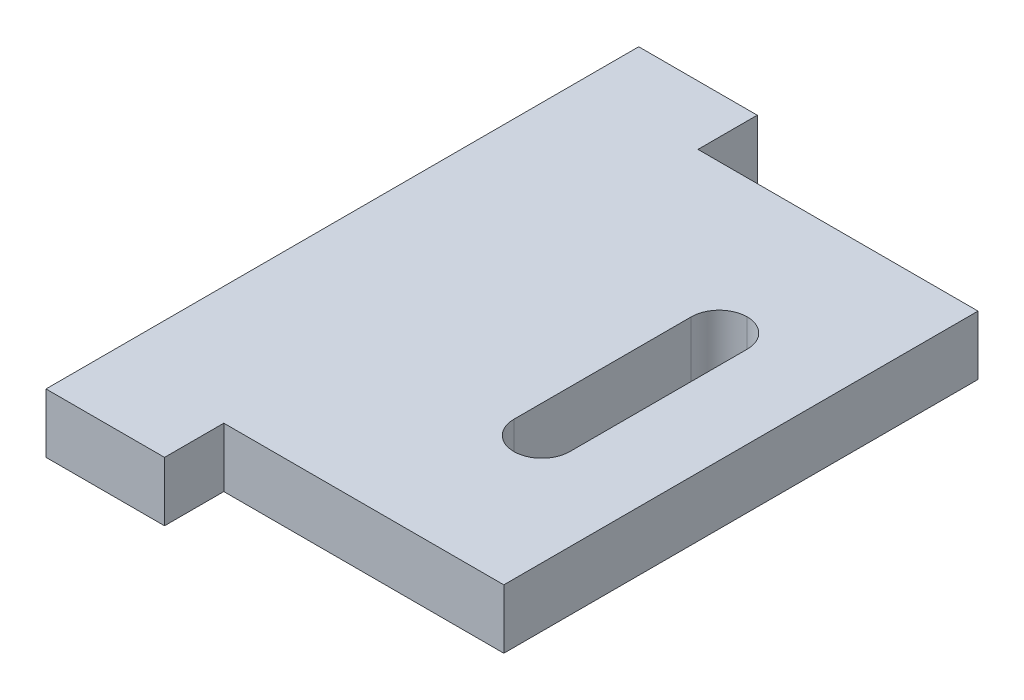
ISO-10303-21;
HEADER;
FILE_DESCRIPTION(('STEP AP214'),'2;1');
FILE_NAME('part.step','',(''),(''),'','','');
FILE_SCHEMA(('AUTOMOTIVE_DESIGN { 1 0 10303 214 1 1 1 1 }'));
ENDSEC;
DATA;
#1=APPLICATION_CONTEXT('core data for automotive mechanical design processes');
#2=APPLICATION_PROTOCOL_DEFINITION('international standard','automotive_design',2000,#1);
#3=PRODUCT_CONTEXT('',#1,'mechanical');
#4=PRODUCT('Part','Part','',(#3));
#5=PRODUCT_RELATED_PRODUCT_CATEGORY('part','',(#4));
#6=PRODUCT_DEFINITION_FORMATION('','',#4);
#7=PRODUCT_DEFINITION_CONTEXT('part definition',#1,'design');
#8=PRODUCT_DEFINITION('design','',#6,#7);
#9=PRODUCT_DEFINITION_SHAPE('','',#8);
#10=(LENGTH_UNIT() NAMED_UNIT(*) SI_UNIT(.MILLI.,.METRE.));
#11=(NAMED_UNIT(*) PLANE_ANGLE_UNIT() SI_UNIT($,.RADIAN.));
#12=(NAMED_UNIT(*) SI_UNIT($,.STERADIAN.) SOLID_ANGLE_UNIT());
#13=UNCERTAINTY_MEASURE_WITH_UNIT(LENGTH_MEASURE(1.E-05),#10,'distance_accuracy_value','');
#14=(GEOMETRIC_REPRESENTATION_CONTEXT(3) GLOBAL_UNCERTAINTY_ASSIGNED_CONTEXT((#13)) GLOBAL_UNIT_ASSIGNED_CONTEXT((#10,
#11,#12)) REPRESENTATION_CONTEXT('',''));
#15=CARTESIAN_POINT('',(0.,0.,0.));
#16=DIRECTION('',(0.,0.,1.));
#17=DIRECTION('',(1.,0.,0.));
#18=AXIS2_PLACEMENT_3D('',#15,#16,#17);
#19=CARTESIAN_POINT('',(-7.5,3.175,0.));
#20=DIRECTION('',(1.,0.,0.));
#21=DIRECTION('',(0.,0.,-1.));
#22=AXIS2_PLACEMENT_3D('',#19,#20,#21);
#23=PLANE('',#22);
#24=DIRECTION('',(0.,0.,1.));
#25=VECTOR('',#24,1.);
#26=CARTESIAN_POINT('',(-7.5,0.,0.));
#27=LINE('',#26,#25);
#28=CARTESIAN_POINT('',(-7.5,0.,-15.875));
#29=VERTEX_POINT('',#28);
#30=CARTESIAN_POINT('',(-7.5,0.,-12.7));
#31=VERTEX_POINT('',#30);
#32=EDGE_CURVE('E149',#29,#31,#27,.T.);
#33=ORIENTED_EDGE('',*,*,#32,.F.);
#34=DIRECTION('',(0.,-1.,0.));
#35=VECTOR('',#34,1.);
#36=CARTESIAN_POINT('',(-7.5,3.175,-15.875));
#37=LINE('',#36,#35);
#38=CARTESIAN_POINT('',(-7.5,3.175,-15.875));
#39=VERTEX_POINT('',#38);
#40=EDGE_CURVE('E145',#39,#29,#37,.T.);
#41=ORIENTED_EDGE('',*,*,#40,.F.);
#42=DIRECTION('',(0.,0.,1.));
#43=VECTOR('',#42,1.);
#44=CARTESIAN_POINT('',(-7.5,3.175,0.));
#45=LINE('',#44,#43);
#46=CARTESIAN_POINT('',(-7.5,3.175,-12.7));
#47=VERTEX_POINT('',#46);
#48=EDGE_CURVE('E148',#39,#47,#45,.T.);
#49=ORIENTED_EDGE('',*,*,#48,.T.);
#50=DIRECTION('',(0.,-1.,0.));
#51=VECTOR('',#50,1.);
#52=CARTESIAN_POINT('',(-7.5,3.175,-12.7));
#53=LINE('',#52,#51);
#54=EDGE_CURVE('E185',#47,#31,#53,.T.);
#55=ORIENTED_EDGE('',*,*,#54,.T.);
#56=EDGE_LOOP('',(#33,#41,#49,#55));
#57=FACE_BOUND('',#56,.T.);
#58=ADVANCED_FACE('F41',(#57),#23,.T.);
#59=CARTESIAN_POINT('',(0.,3.175,-15.875));
#60=DIRECTION('',(0.,0.,-1.));
#61=DIRECTION('',(-1.,0.,0.));
#62=AXIS2_PLACEMENT_3D('',#59,#60,#61);
#63=PLANE('',#62);
#64=DIRECTION('',(1.,0.,0.));
#65=VECTOR('',#64,1.);
#66=CARTESIAN_POINT('',(0.,0.,-15.875));
#67=LINE('',#66,#65);
#68=CARTESIAN_POINT('',(-13.85,0.,-15.875));
#69=VERTEX_POINT('',#68);
#70=EDGE_CURVE('E184',#69,#29,#67,.T.);
#71=ORIENTED_EDGE('',*,*,#70,.F.);
#72=DIRECTION('',(0.,-1.,0.));
#73=VECTOR('',#72,1.);
#74=CARTESIAN_POINT('',(-13.85,3.175,-15.875));
#75=LINE('',#74,#73);
#76=CARTESIAN_POINT('',(-13.85,3.175,-15.875));
#77=VERTEX_POINT('',#76);
#78=EDGE_CURVE('E154',#77,#69,#75,.T.);
#79=ORIENTED_EDGE('',*,*,#78,.F.);
#80=DIRECTION('',(1.,0.,0.));
#81=VECTOR('',#80,1.);
#82=CARTESIAN_POINT('',(0.,3.175,-15.875));
#83=LINE('',#82,#81);
#84=EDGE_CURVE('E159',#77,#39,#83,.T.);
#85=ORIENTED_EDGE('',*,*,#84,.T.);
#86=ORIENTED_EDGE('',*,*,#40,.T.);
#87=EDGE_LOOP('',(#71,#79,#85,#86));
#88=FACE_BOUND('',#87,.T.);
#89=ADVANCED_FACE('F170',(#88),#63,.T.);
#90=CARTESIAN_POINT('',(-13.85,3.175,0.));
#91=DIRECTION('',(1.,0.,0.));
#92=DIRECTION('',(0.,0.,-1.));
#93=AXIS2_PLACEMENT_3D('',#90,#91,#92);
#94=PLANE('',#93);
#95=DIRECTION('',(0.,0.,1.));
#96=VECTOR('',#95,1.);
#97=CARTESIAN_POINT('',(-13.85,0.,0.));
#98=LINE('',#97,#96);
#99=CARTESIAN_POINT('',(-13.85,0.,15.875));
#100=VERTEX_POINT('',#99);
#101=EDGE_CURVE('E187',#69,#100,#98,.T.);
#102=ORIENTED_EDGE('',*,*,#101,.T.);
#103=DIRECTION('',(0.,-1.,0.));
#104=VECTOR('',#103,1.);
#105=CARTESIAN_POINT('',(-13.85,3.175,15.875));
#106=LINE('',#105,#104);
#107=CARTESIAN_POINT('',(-13.85,3.175,15.875));
#108=VERTEX_POINT('',#107);
#109=EDGE_CURVE('E209',#108,#100,#106,.T.);
#110=ORIENTED_EDGE('',*,*,#109,.F.);
#111=DIRECTION('',(0.,0.,1.));
#112=VECTOR('',#111,1.);
#113=CARTESIAN_POINT('',(-13.85,3.175,0.));
#114=LINE('',#113,#112);
#115=EDGE_CURVE('E166',#77,#108,#114,.T.);
#116=ORIENTED_EDGE('',*,*,#115,.F.);
#117=ORIENTED_EDGE('',*,*,#78,.T.);
#118=EDGE_LOOP('',(#102,#110,#116,#117));
#119=FACE_BOUND('',#118,.T.);
#120=ADVANCED_FACE('F285',(#119),#94,.F.);
#121=CARTESIAN_POINT('',(0.,3.175,15.875));
#122=DIRECTION('',(0.,0.,-1.));
#123=DIRECTION('',(-1.,0.,0.));
#124=AXIS2_PLACEMENT_3D('',#121,#122,#123);
#125=PLANE('',#124);
#126=DIRECTION('',(1.,0.,0.));
#127=VECTOR('',#126,1.);
#128=CARTESIAN_POINT('',(0.,0.,15.875));
#129=LINE('',#128,#127);
#130=CARTESIAN_POINT('',(-7.5,0.,15.875));
#131=VERTEX_POINT('',#130);
#132=EDGE_CURVE('E186',#100,#131,#129,.T.);
#133=ORIENTED_EDGE('',*,*,#132,.T.);
#134=DIRECTION('',(0.,-1.,0.));
#135=VECTOR('',#134,1.);
#136=CARTESIAN_POINT('',(-7.5,3.175,15.875));
#137=LINE('',#136,#135);
#138=CARTESIAN_POINT('',(-7.5,3.175,15.875));
#139=VERTEX_POINT('',#138);
#140=EDGE_CURVE('E208',#139,#131,#137,.T.);
#141=ORIENTED_EDGE('',*,*,#140,.F.);
#142=DIRECTION('',(1.,0.,0.));
#143=VECTOR('',#142,1.);
#144=CARTESIAN_POINT('',(0.,3.175,15.875));
#145=LINE('',#144,#143);
#146=EDGE_CURVE('E173',#108,#139,#145,.T.);
#147=ORIENTED_EDGE('',*,*,#146,.F.);
#148=ORIENTED_EDGE('',*,*,#109,.T.);
#149=EDGE_LOOP('',(#133,#141,#147,#148));
#150=FACE_BOUND('',#149,.T.);
#151=ADVANCED_FACE('F289',(#150),#125,.F.);
#152=CARTESIAN_POINT('',(-7.5,0.,12.7));
#153=VERTEX_POINT('',#152);
#154=EDGE_CURVE('E188',#153,#131,#27,.T.);
#155=ORIENTED_EDGE('',*,*,#154,.F.);
#156=DIRECTION('',(0.,-1.,0.));
#157=VECTOR('',#156,1.);
#158=CARTESIAN_POINT('',(-7.5,3.175,12.7));
#159=LINE('',#158,#157);
#160=CARTESIAN_POINT('',(-7.5,3.175,12.7));
#161=VERTEX_POINT('',#160);
#162=EDGE_CURVE('E206',#161,#153,#159,.T.);
#163=ORIENTED_EDGE('',*,*,#162,.F.);
#164=EDGE_CURVE('E167',#161,#139,#45,.T.);
#165=ORIENTED_EDGE('',*,*,#164,.T.);
#166=ORIENTED_EDGE('',*,*,#140,.T.);
#167=EDGE_LOOP('',(#155,#163,#165,#166));
#168=FACE_BOUND('',#167,.T.);
#169=ADVANCED_FACE('F278',(#168),#23,.T.);
#170=CARTESIAN_POINT('',(0.,3.175,12.7));
#171=DIRECTION('',(0.,0.,-1.));
#172=DIRECTION('',(-1.,0.,0.));
#173=AXIS2_PLACEMENT_3D('',#170,#171,#172);
#174=PLANE('',#173);
#175=DIRECTION('',(1.,0.,0.));
#176=VECTOR('',#175,1.);
#177=CARTESIAN_POINT('',(0.,0.,12.7));
#178=LINE('',#177,#176);
#179=CARTESIAN_POINT('',(7.5,0.,12.7));
#180=VERTEX_POINT('',#179);
#181=EDGE_CURVE('E193',#153,#180,#178,.T.);
#182=ORIENTED_EDGE('',*,*,#181,.T.);
#183=DIRECTION('',(0.,-1.,0.));
#184=VECTOR('',#183,1.);
#185=CARTESIAN_POINT('',(7.5,3.175,12.7));
#186=LINE('',#185,#184);
#187=CARTESIAN_POINT('',(7.5,3.175,12.7));
#188=VERTEX_POINT('',#187);
#189=EDGE_CURVE('E204',#188,#180,#186,.T.);
#190=ORIENTED_EDGE('',*,*,#189,.F.);
#191=DIRECTION('',(1.,0.,0.));
#192=VECTOR('',#191,1.);
#193=CARTESIAN_POINT('',(0.,3.175,12.7));
#194=LINE('',#193,#192);
#195=EDGE_CURVE('E176',#161,#188,#194,.T.);
#196=ORIENTED_EDGE('',*,*,#195,.F.);
#197=ORIENTED_EDGE('',*,*,#162,.T.);
#198=EDGE_LOOP('',(#182,#190,#196,#197));
#199=FACE_BOUND('',#198,.T.);
#200=ADVANCED_FACE('F287',(#199),#174,.F.);
#201=CARTESIAN_POINT('',(7.5,3.175,0.));
#202=DIRECTION('',(1.,0.,0.));
#203=DIRECTION('',(0.,0.,-1.));
#204=AXIS2_PLACEMENT_3D('',#201,#202,#203);
#205=PLANE('',#204);
#206=DIRECTION('',(0.,0.,1.));
#207=VECTOR('',#206,1.);
#208=CARTESIAN_POINT('',(7.5,0.,0.));
#209=LINE('',#208,#207);
#210=CARTESIAN_POINT('',(7.5,0.,-12.7));
#211=VERTEX_POINT('',#210);
#212=EDGE_CURVE('E198',#211,#180,#209,.T.);
#213=ORIENTED_EDGE('',*,*,#212,.F.);
#214=DIRECTION('',(0.,-1.,0.));
#215=VECTOR('',#214,1.);
#216=CARTESIAN_POINT('',(7.5,3.175,-12.7));
#217=LINE('',#216,#215);
#218=CARTESIAN_POINT('',(7.5,3.175,-12.7));
#219=VERTEX_POINT('',#218);
#220=EDGE_CURVE('E205',#219,#211,#217,.T.);
#221=ORIENTED_EDGE('',*,*,#220,.F.);
#222=DIRECTION('',(0.,0.,1.));
#223=VECTOR('',#222,1.);
#224=CARTESIAN_POINT('',(7.5,3.175,0.));
#225=LINE('',#224,#223);
#226=EDGE_CURVE('E178',#219,#188,#225,.T.);
#227=ORIENTED_EDGE('',*,*,#226,.T.);
#228=ORIENTED_EDGE('',*,*,#189,.T.);
#229=EDGE_LOOP('',(#213,#221,#227,#228));
#230=FACE_BOUND('',#229,.T.);
#231=ADVANCED_FACE('F298',(#230),#205,.T.);
#232=CARTESIAN_POINT('',(0.,3.175,-12.7));
#233=DIRECTION('',(0.,0.,-1.));
#234=DIRECTION('',(-1.,0.,0.));
#235=AXIS2_PLACEMENT_3D('',#232,#233,#234);
#236=PLANE('',#235);
#237=DIRECTION('',(1.,0.,0.));
#238=VECTOR('',#237,1.);
#239=CARTESIAN_POINT('',(0.,0.,-12.7));
#240=LINE('',#239,#238);
#241=EDGE_CURVE('E163',#31,#211,#240,.T.);
#242=ORIENTED_EDGE('',*,*,#241,.F.);
#243=ORIENTED_EDGE('',*,*,#54,.F.);
#244=DIRECTION('',(1.,0.,0.));
#245=VECTOR('',#244,1.);
#246=CARTESIAN_POINT('',(0.,3.175,-12.7));
#247=LINE('',#246,#245);
#248=EDGE_CURVE('E162',#47,#219,#247,.T.);
#249=ORIENTED_EDGE('',*,*,#248,.T.);
#250=ORIENTED_EDGE('',*,*,#220,.T.);
#251=EDGE_LOOP('',(#242,#243,#249,#250));
#252=FACE_BOUND('',#251,.T.);
#253=ADVANCED_FACE('F312',(#252),#236,.T.);
#254=CARTESIAN_POINT('',(0.,3.175,0.));
#255=DIRECTION('',(0.,1.,0.));
#256=DIRECTION('',(0.,0.,1.));
#257=AXIS2_PLACEMENT_3D('',#254,#255,#256);
#258=PLANE('',#257);
#259=DIRECTION('',(0.,0.,1.));
#260=VECTOR('',#259,1.);
#261=CARTESIAN_POINT('',(0.0875000000000026,3.175,0.));
#262=LINE('',#261,#260);
#263=CARTESIAN_POINT('',(0.0875000000000025,3.175,-4.75));
#264=VERTEX_POINT('',#263);
#265=CARTESIAN_POINT('',(0.0875000000000027,3.175,4.75));
#266=VERTEX_POINT('',#265);
#267=EDGE_CURVE('E183',#264,#266,#262,.T.);
#268=ORIENTED_EDGE('',*,*,#267,.F.);
#269=CARTESIAN_POINT('',(1.5875,3.175,-4.75));
#270=DIRECTION('',(0.,1.,0.));
#271=DIRECTION('',(0.,0.,1.));
#272=AXIS2_PLACEMENT_3D('',#269,#270,#271);
#273=CIRCLE('',#272,1.5);
#274=CARTESIAN_POINT('',(1.5875,3.175,-6.25));
#275=VERTEX_POINT('',#274);
#276=EDGE_CURVE('E49',#264,#275,#273,.F.);
#277=ORIENTED_EDGE('',*,*,#276,.T.);
#278=CARTESIAN_POINT('',(1.5875,3.175,-4.75));
#279=DIRECTION('',(0.,1.,0.));
#280=DIRECTION('',(0.,0.,1.));
#281=AXIS2_PLACEMENT_3D('',#278,#279,#280);
#282=CIRCLE('',#281,1.5);
#283=CARTESIAN_POINT('',(3.0875,3.175,-4.75));
#284=VERTEX_POINT('',#283);
#285=EDGE_CURVE('E224',#275,#284,#282,.F.);
#286=ORIENTED_EDGE('',*,*,#285,.T.);
#287=DIRECTION('',(0.,0.,-1.));
#288=VECTOR('',#287,1.);
#289=CARTESIAN_POINT('',(3.0875,3.175,0.));
#290=LINE('',#289,#288);
#291=CARTESIAN_POINT('',(3.0875,3.175,4.75));
#292=VERTEX_POINT('',#291);
#293=EDGE_CURVE('E254',#292,#284,#290,.T.);
#294=ORIENTED_EDGE('',*,*,#293,.F.);
#295=CARTESIAN_POINT('',(1.5875,3.175,4.75));
#296=DIRECTION('',(0.,1.,0.));
#297=DIRECTION('',(0.,0.,1.));
#298=AXIS2_PLACEMENT_3D('',#295,#296,#297);
#299=CIRCLE('',#298,1.5);
#300=CARTESIAN_POINT('',(1.5875,3.175,6.25));
#301=VERTEX_POINT('',#300);
#302=EDGE_CURVE('E66',#292,#301,#299,.F.);
#303=ORIENTED_EDGE('',*,*,#302,.T.);
#304=CARTESIAN_POINT('',(1.5875,3.175,4.75));
#305=DIRECTION('',(0.,1.,0.));
#306=DIRECTION('',(0.,0.,1.));
#307=AXIS2_PLACEMENT_3D('',#304,#305,#306);
#308=CIRCLE('',#307,1.5);
#309=EDGE_CURVE('E226',#301,#266,#308,.F.);
#310=ORIENTED_EDGE('',*,*,#309,.T.);
#311=EDGE_LOOP('',(#268,#277,#286,#294,#303,#310));
#312=FACE_BOUND('',#311,.T.);
#313=ORIENTED_EDGE('',*,*,#48,.F.);
#314=ORIENTED_EDGE('',*,*,#84,.F.);
#315=ORIENTED_EDGE('',*,*,#115,.T.);
#316=ORIENTED_EDGE('',*,*,#146,.T.);
#317=ORIENTED_EDGE('',*,*,#164,.F.);
#318=ORIENTED_EDGE('',*,*,#195,.T.);
#319=ORIENTED_EDGE('',*,*,#226,.F.);
#320=ORIENTED_EDGE('',*,*,#248,.F.);
#321=EDGE_LOOP('',(#313,#314,#315,#316,#317,#318,#319,#320));
#322=FACE_BOUND('',#321,.T.);
#323=ADVANCED_FACE('F157',(#312,#322),#258,.T.);
#324=CARTESIAN_POINT('',(0.,0.,0.));
#325=DIRECTION('',(0.,1.,0.));
#326=DIRECTION('',(0.,0.,1.));
#327=AXIS2_PLACEMENT_3D('',#324,#325,#326);
#328=PLANE('',#327);
#329=CARTESIAN_POINT('',(1.5875,0.,-4.75));
#330=DIRECTION('',(0.,1.,0.));
#331=DIRECTION('',(0.,0.,1.));
#332=AXIS2_PLACEMENT_3D('',#329,#330,#331);
#333=CIRCLE('',#332,1.5);
#334=CARTESIAN_POINT('',(3.0875,0.,-4.75));
#335=VERTEX_POINT('',#334);
#336=CARTESIAN_POINT('',(1.5875,0.,-6.25));
#337=VERTEX_POINT('',#336);
#338=EDGE_CURVE('E223',#335,#337,#333,.T.);
#339=ORIENTED_EDGE('',*,*,#338,.T.);
#340=CARTESIAN_POINT('',(1.5875,0.,-4.75));
#341=DIRECTION('',(0.,1.,0.));
#342=DIRECTION('',(0.,0.,1.));
#343=AXIS2_PLACEMENT_3D('',#340,#341,#342);
#344=CIRCLE('',#343,1.5);
#345=CARTESIAN_POINT('',(0.0875000000000025,0.,-4.75));
#346=VERTEX_POINT('',#345);
#347=EDGE_CURVE('E11',#337,#346,#344,.T.);
#348=ORIENTED_EDGE('',*,*,#347,.T.);
#349=DIRECTION('',(0.,0.,1.));
#350=VECTOR('',#349,1.);
#351=CARTESIAN_POINT('',(0.0875000000000025,0.,-6.25));
#352=LINE('',#351,#350);
#353=CARTESIAN_POINT('',(0.0875000000000027,0.,4.75));
#354=VERTEX_POINT('',#353);
#355=EDGE_CURVE('E234',#346,#354,#352,.T.);
#356=ORIENTED_EDGE('',*,*,#355,.T.);
#357=CARTESIAN_POINT('',(1.5875,0.,4.75));
#358=DIRECTION('',(0.,1.,0.));
#359=DIRECTION('',(0.,0.,1.));
#360=AXIS2_PLACEMENT_3D('',#357,#358,#359);
#361=CIRCLE('',#360,1.5);
#362=CARTESIAN_POINT('',(1.5875,0.,6.25));
#363=VERTEX_POINT('',#362);
#364=EDGE_CURVE('E59',#354,#363,#361,.T.);
#365=ORIENTED_EDGE('',*,*,#364,.T.);
#366=CARTESIAN_POINT('',(1.5875,0.,4.75));
#367=DIRECTION('',(0.,1.,0.));
#368=DIRECTION('',(0.,0.,1.));
#369=AXIS2_PLACEMENT_3D('',#366,#367,#368);
#370=CIRCLE('',#369,1.5);
#371=CARTESIAN_POINT('',(3.0875,0.,4.75));
#372=VERTEX_POINT('',#371);
#373=EDGE_CURVE('E227',#363,#372,#370,.T.);
#374=ORIENTED_EDGE('',*,*,#373,.T.);
#375=DIRECTION('',(0.,0.,-1.));
#376=VECTOR('',#375,1.);
#377=CARTESIAN_POINT('',(3.0875,0.,-6.25));
#378=LINE('',#377,#376);
#379=EDGE_CURVE('E239',#372,#335,#378,.T.);
#380=ORIENTED_EDGE('',*,*,#379,.T.);
#381=EDGE_LOOP('',(#339,#348,#356,#365,#374,#380));
#382=FACE_BOUND('',#381,.T.);
#383=ORIENTED_EDGE('',*,*,#32,.T.);
#384=ORIENTED_EDGE('',*,*,#241,.T.);
#385=ORIENTED_EDGE('',*,*,#212,.T.);
#386=ORIENTED_EDGE('',*,*,#181,.F.);
#387=ORIENTED_EDGE('',*,*,#154,.T.);
#388=ORIENTED_EDGE('',*,*,#132,.F.);
#389=ORIENTED_EDGE('',*,*,#101,.F.);
#390=ORIENTED_EDGE('',*,*,#70,.T.);
#391=EDGE_LOOP('',(#383,#384,#385,#386,#387,#388,#389,#390));
#392=FACE_BOUND('',#391,.T.);
#393=ADVANCED_FACE('F261',(#382,#392),#328,.F.);
#394=CARTESIAN_POINT('',(0.0875000000000025,0.,-6.25));
#395=DIRECTION('',(-1.,0.,0.));
#396=DIRECTION('',(0.,0.,1.));
#397=AXIS2_PLACEMENT_3D('',#394,#395,#396);
#398=PLANE('',#397);
#399=ORIENTED_EDGE('',*,*,#267,.T.);
#400=DIRECTION('',(0.,1.,0.));
#401=VECTOR('',#400,1.);
#402=CARTESIAN_POINT('',(0.0875000000000027,0.,4.75));
#403=LINE('',#402,#401);
#404=EDGE_CURVE('E222',#266,#354,#403,.F.);
#405=ORIENTED_EDGE('',*,*,#404,.T.);
#406=ORIENTED_EDGE('',*,*,#355,.F.);
#407=DIRECTION('',(0.,1.,0.));
#408=VECTOR('',#407,1.);
#409=CARTESIAN_POINT('',(0.0875000000000025,3.175,-4.75));
#410=LINE('',#409,#408);
#411=EDGE_CURVE('E218',#346,#264,#410,.T.);
#412=ORIENTED_EDGE('',*,*,#411,.T.);
#413=EDGE_LOOP('',(#399,#405,#406,#412));
#414=FACE_BOUND('',#413,.T.);
#415=ADVANCED_FACE('F252',(#414),#398,.F.);
#416=CARTESIAN_POINT('',(3.0875,0.,-6.25));
#417=DIRECTION('',(1.,0.,0.));
#418=DIRECTION('',(0.,0.,-1.));
#419=AXIS2_PLACEMENT_3D('',#416,#417,#418);
#420=PLANE('',#419);
#421=ORIENTED_EDGE('',*,*,#293,.T.);
#422=DIRECTION('',(0.,1.,0.));
#423=VECTOR('',#422,1.);
#424=CARTESIAN_POINT('',(3.0875,0.,-4.75));
#425=LINE('',#424,#423);
#426=EDGE_CURVE('E216',#284,#335,#425,.F.);
#427=ORIENTED_EDGE('',*,*,#426,.T.);
#428=ORIENTED_EDGE('',*,*,#379,.F.);
#429=DIRECTION('',(0.,1.,0.));
#430=VECTOR('',#429,1.);
#431=CARTESIAN_POINT('',(3.0875,3.175,4.75));
#432=LINE('',#431,#430);
#433=EDGE_CURVE('E152',#372,#292,#432,.T.);
#434=ORIENTED_EDGE('',*,*,#433,.T.);
#435=EDGE_LOOP('',(#421,#427,#428,#434));
#436=FACE_BOUND('',#435,.T.);
#437=ADVANCED_FACE('F264',(#436),#420,.F.);
#438=CARTESIAN_POINT('',(1.5875,0.,-4.75));
#439=DIRECTION('',(0.,-1.,0.));
#440=DIRECTION('',(0.,0.,-1.));
#441=AXIS2_PLACEMENT_3D('',#438,#439,#440);
#442=CYLINDRICAL_SURFACE('',#441,1.5);
#443=ORIENTED_EDGE('',*,*,#411,.F.);
#444=ORIENTED_EDGE('',*,*,#347,.F.);
#445=DIRECTION('',(0.,1.,0.));
#446=VECTOR('',#445,1.);
#447=CARTESIAN_POINT('',(1.5875,0.,-6.25));
#448=LINE('',#447,#446);
#449=EDGE_CURVE('E233',#275,#337,#448,.F.);
#450=ORIENTED_EDGE('',*,*,#449,.F.);
#451=ORIENTED_EDGE('',*,*,#276,.F.);
#452=EDGE_LOOP('',(#443,#444,#450,#451));
#453=FACE_BOUND('',#452,.T.);
#454=ADVANCED_FACE('F267',(#453),#442,.F.);
#455=CARTESIAN_POINT('',(1.5875,0.,-4.75));
#456=DIRECTION('',(0.,-1.,0.));
#457=DIRECTION('',(0.,0.,-1.));
#458=AXIS2_PLACEMENT_3D('',#455,#456,#457);
#459=CYLINDRICAL_SURFACE('',#458,1.5);
#460=ORIENTED_EDGE('',*,*,#338,.F.);
#461=ORIENTED_EDGE('',*,*,#426,.F.);
#462=ORIENTED_EDGE('',*,*,#285,.F.);
#463=ORIENTED_EDGE('',*,*,#449,.T.);
#464=EDGE_LOOP('',(#460,#461,#462,#463));
#465=FACE_BOUND('',#464,.T.);
#466=ADVANCED_FACE('F270',(#465),#459,.F.);
#467=CARTESIAN_POINT('',(1.5875,0.,4.75));
#468=DIRECTION('',(0.,-1.,0.));
#469=DIRECTION('',(0.,0.,-1.));
#470=AXIS2_PLACEMENT_3D('',#467,#468,#469);
#471=CYLINDRICAL_SURFACE('',#470,1.5);
#472=DIRECTION('',(0.,1.,0.));
#473=VECTOR('',#472,1.);
#474=CARTESIAN_POINT('',(1.5875,3.175,6.25));
#475=LINE('',#474,#473);
#476=EDGE_CURVE('E44',#363,#301,#475,.T.);
#477=ORIENTED_EDGE('',*,*,#476,.F.);
#478=ORIENTED_EDGE('',*,*,#364,.F.);
#479=ORIENTED_EDGE('',*,*,#404,.F.);
#480=ORIENTED_EDGE('',*,*,#309,.F.);
#481=EDGE_LOOP('',(#477,#478,#479,#480));
#482=FACE_BOUND('',#481,.T.);
#483=ADVANCED_FACE('F43',(#482),#471,.F.);
#484=CARTESIAN_POINT('',(1.5875,0.,4.75));
#485=DIRECTION('',(0.,-1.,0.));
#486=DIRECTION('',(0.,0.,-1.));
#487=AXIS2_PLACEMENT_3D('',#484,#485,#486);
#488=CYLINDRICAL_SURFACE('',#487,1.5);
#489=ORIENTED_EDGE('',*,*,#373,.F.);
#490=ORIENTED_EDGE('',*,*,#476,.T.);
#491=ORIENTED_EDGE('',*,*,#302,.F.);
#492=ORIENTED_EDGE('',*,*,#433,.F.);
#493=EDGE_LOOP('',(#489,#490,#491,#492));
#494=FACE_BOUND('',#493,.T.);
#495=ADVANCED_FACE('F245',(#494),#488,.F.);
#496=CLOSED_SHELL('',(#58,#89,#120,#151,#169,#200,#231,#253,#323,#393,#415,#437,#454,#466,#483,#495));
#497=MANIFOLD_SOLID_BREP('B2',#496);
#498=ADVANCED_BREP_SHAPE_REPRESENTATION('',(#18,#497),#14);
#499=SHAPE_DEFINITION_REPRESENTATION(#9,#498);
ENDSEC;
END-ISO-10303-21;
